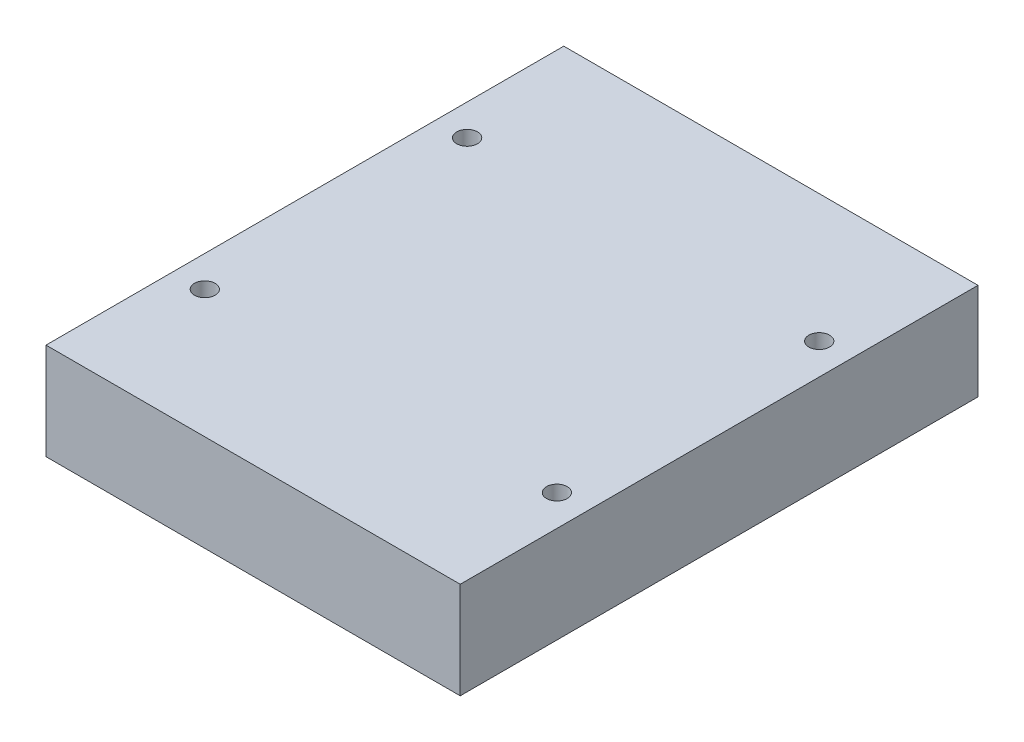
ISO-10303-21;
HEADER;
FILE_DESCRIPTION(('STEP AP214'),'2;1');
FILE_NAME('part.step','',(''),(''),'','','');
FILE_SCHEMA(('AUTOMOTIVE_DESIGN { 1 0 10303 214 1 1 1 1 }'));
ENDSEC;
DATA;
#1=APPLICATION_CONTEXT('core data for automotive mechanical design processes');
#2=APPLICATION_PROTOCOL_DEFINITION('international standard','automotive_design',2000,#1);
#3=PRODUCT_CONTEXT('',#1,'mechanical');
#4=PRODUCT('Part','Part','',(#3));
#5=PRODUCT_RELATED_PRODUCT_CATEGORY('part','',(#4));
#6=PRODUCT_DEFINITION_FORMATION('','',#4);
#7=PRODUCT_DEFINITION_CONTEXT('part definition',#1,'design');
#8=PRODUCT_DEFINITION('design','',#6,#7);
#9=PRODUCT_DEFINITION_SHAPE('','',#8);
#10=(LENGTH_UNIT() NAMED_UNIT(*) SI_UNIT(.MILLI.,.METRE.));
#11=(NAMED_UNIT(*) PLANE_ANGLE_UNIT() SI_UNIT($,.RADIAN.));
#12=(NAMED_UNIT(*) SI_UNIT($,.STERADIAN.) SOLID_ANGLE_UNIT());
#13=UNCERTAINTY_MEASURE_WITH_UNIT(LENGTH_MEASURE(1.E-05),#10,'distance_accuracy_value','');
#14=(GEOMETRIC_REPRESENTATION_CONTEXT(3) GLOBAL_UNCERTAINTY_ASSIGNED_CONTEXT((#13)) GLOBAL_UNIT_ASSIGNED_CONTEXT((#10,
#11,#12)) REPRESENTATION_CONTEXT('',''));
#15=CARTESIAN_POINT('',(0.,0.,0.));
#16=DIRECTION('',(0.,0.,1.));
#17=DIRECTION('',(1.,0.,0.));
#18=AXIS2_PLACEMENT_3D('',#15,#16,#17);
#19=CARTESIAN_POINT('',(30.,14.,-37.5));
#20=DIRECTION('',(-1.,0.,0.));
#21=DIRECTION('',(0.,0.,1.));
#22=AXIS2_PLACEMENT_3D('',#19,#20,#21);
#23=PLANE('',#22);
#24=DIRECTION('',(0.,0.,-1.));
#25=VECTOR('',#24,1.);
#26=CARTESIAN_POINT('',(30.,0.,-37.5));
#27=LINE('',#26,#25);
#28=CARTESIAN_POINT('',(30.,0.,37.5));
#29=VERTEX_POINT('',#28);
#30=CARTESIAN_POINT('',(30.,0.,-37.5));
#31=VERTEX_POINT('',#30);
#32=EDGE_CURVE('E96',#29,#31,#27,.T.);
#33=ORIENTED_EDGE('',*,*,#32,.T.);
#34=DIRECTION('',(0.,-1.,0.));
#35=VECTOR('',#34,1.);
#36=CARTESIAN_POINT('',(30.,14.,-37.5));
#37=LINE('',#36,#35);
#38=CARTESIAN_POINT('',(30.,14.,-37.5));
#39=VERTEX_POINT('',#38);
#40=EDGE_CURVE('E11',#39,#31,#37,.T.);
#41=ORIENTED_EDGE('',*,*,#40,.F.);
#42=DIRECTION('',(0.,0.,-1.));
#43=VECTOR('',#42,1.);
#44=CARTESIAN_POINT('',(30.,14.,-37.5));
#45=LINE('',#44,#43);
#46=CARTESIAN_POINT('',(30.,14.,37.5));
#47=VERTEX_POINT('',#46);
#48=EDGE_CURVE('E84',#47,#39,#45,.T.);
#49=ORIENTED_EDGE('',*,*,#48,.F.);
#50=DIRECTION('',(0.,-1.,0.));
#51=VECTOR('',#50,1.);
#52=CARTESIAN_POINT('',(30.,14.,37.5));
#53=LINE('',#52,#51);
#54=EDGE_CURVE('E92',#47,#29,#53,.T.);
#55=ORIENTED_EDGE('',*,*,#54,.T.);
#56=EDGE_LOOP('',(#33,#41,#49,#55));
#57=FACE_BOUND('',#56,.T.);
#58=ADVANCED_FACE('F33',(#57),#23,.F.);
#59=CARTESIAN_POINT('',(-30.,14.,-37.5));
#60=DIRECTION('',(0.,0.,1.));
#61=DIRECTION('',(1.,0.,0.));
#62=AXIS2_PLACEMENT_3D('',#59,#60,#61);
#63=PLANE('',#62);
#64=DIRECTION('',(-1.,0.,0.));
#65=VECTOR('',#64,1.);
#66=CARTESIAN_POINT('',(-30.,0.,-37.5));
#67=LINE('',#66,#65);
#68=CARTESIAN_POINT('',(-30.,0.,-37.5));
#69=VERTEX_POINT('',#68);
#70=EDGE_CURVE('E88',#31,#69,#67,.T.);
#71=ORIENTED_EDGE('',*,*,#70,.T.);
#72=DIRECTION('',(0.,-1.,0.));
#73=VECTOR('',#72,1.);
#74=CARTESIAN_POINT('',(-30.,14.,-37.5));
#75=LINE('',#74,#73);
#76=CARTESIAN_POINT('',(-30.,14.,-37.5));
#77=VERTEX_POINT('',#76);
#78=EDGE_CURVE('E41',#77,#69,#75,.T.);
#79=ORIENTED_EDGE('',*,*,#78,.F.);
#80=DIRECTION('',(-1.,0.,0.));
#81=VECTOR('',#80,1.);
#82=CARTESIAN_POINT('',(-30.,14.,-37.5));
#83=LINE('',#82,#81);
#84=EDGE_CURVE('E79',#39,#77,#83,.T.);
#85=ORIENTED_EDGE('',*,*,#84,.F.);
#86=ORIENTED_EDGE('',*,*,#40,.T.);
#87=EDGE_LOOP('',(#71,#79,#85,#86));
#88=FACE_BOUND('',#87,.T.);
#89=ADVANCED_FACE('F87',(#88),#63,.F.);
#90=CARTESIAN_POINT('',(-30.,14.,-37.5));
#91=DIRECTION('',(1.,0.,0.));
#92=DIRECTION('',(0.,0.,-1.));
#93=AXIS2_PLACEMENT_3D('',#90,#91,#92);
#94=PLANE('',#93);
#95=DIRECTION('',(0.,0.,1.));
#96=VECTOR('',#95,1.);
#97=CARTESIAN_POINT('',(-30.,0.,-37.5));
#98=LINE('',#97,#96);
#99=CARTESIAN_POINT('',(-30.,0.,37.5));
#100=VERTEX_POINT('',#99);
#101=EDGE_CURVE('E66',#69,#100,#98,.T.);
#102=ORIENTED_EDGE('',*,*,#101,.T.);
#103=DIRECTION('',(0.,-1.,0.));
#104=VECTOR('',#103,1.);
#105=CARTESIAN_POINT('',(-30.,14.,37.5));
#106=LINE('',#105,#104);
#107=CARTESIAN_POINT('',(-30.,14.,37.5));
#108=VERTEX_POINT('',#107);
#109=EDGE_CURVE('E89',#108,#100,#106,.T.);
#110=ORIENTED_EDGE('',*,*,#109,.F.);
#111=DIRECTION('',(0.,0.,1.));
#112=VECTOR('',#111,1.);
#113=CARTESIAN_POINT('',(-30.,14.,-37.5));
#114=LINE('',#113,#112);
#115=EDGE_CURVE('E82',#77,#108,#114,.T.);
#116=ORIENTED_EDGE('',*,*,#115,.F.);
#117=ORIENTED_EDGE('',*,*,#78,.T.);
#118=EDGE_LOOP('',(#102,#110,#116,#117));
#119=FACE_BOUND('',#118,.T.);
#120=ADVANCED_FACE('F90',(#119),#94,.F.);
#121=CARTESIAN_POINT('',(-30.,14.,37.5));
#122=DIRECTION('',(0.,0.,-1.));
#123=DIRECTION('',(-1.,0.,0.));
#124=AXIS2_PLACEMENT_3D('',#121,#122,#123);
#125=PLANE('',#124);
#126=DIRECTION('',(1.,0.,0.));
#127=VECTOR('',#126,1.);
#128=CARTESIAN_POINT('',(-30.,0.,37.5));
#129=LINE('',#128,#127);
#130=EDGE_CURVE('E72',#100,#29,#129,.T.);
#131=ORIENTED_EDGE('',*,*,#130,.T.);
#132=ORIENTED_EDGE('',*,*,#54,.F.);
#133=DIRECTION('',(1.,0.,0.));
#134=VECTOR('',#133,1.);
#135=CARTESIAN_POINT('',(-30.,14.,37.5));
#136=LINE('',#135,#134);
#137=EDGE_CURVE('E49',#108,#47,#136,.T.);
#138=ORIENTED_EDGE('',*,*,#137,.F.);
#139=ORIENTED_EDGE('',*,*,#109,.T.);
#140=EDGE_LOOP('',(#131,#132,#138,#139));
#141=FACE_BOUND('',#140,.T.);
#142=ADVANCED_FACE('F104',(#141),#125,.F.);
#143=CARTESIAN_POINT('',(0.,14.,0.));
#144=DIRECTION('',(0.,1.,0.));
#145=DIRECTION('',(0.,0.,1.));
#146=AXIS2_PLACEMENT_3D('',#143,#144,#145);
#147=PLANE('',#146);
#148=CARTESIAN_POINT('',(-25.5,14.,19.));
#149=DIRECTION('',(0.,1.,0.));
#150=DIRECTION('',(0.,0.,1.));
#151=AXIS2_PLACEMENT_3D('',#148,#149,#150);
#152=CIRCLE('',#151,1.5);
#153=CARTESIAN_POINT('',(-25.5,14.,20.5));
#154=VERTEX_POINT('',#153);
#155=EDGE_CURVE('E128',#154,#154,#152,.T.);
#156=ORIENTED_EDGE('',*,*,#155,.F.);
#157=EDGE_LOOP('',(#156));
#158=FACE_BOUND('',#157,.T.);
#159=CARTESIAN_POINT('',(25.5,14.,19.));
#160=DIRECTION('',(0.,1.,0.));
#161=DIRECTION('',(0.,0.,1.));
#162=AXIS2_PLACEMENT_3D('',#159,#160,#161);
#163=CIRCLE('',#162,1.5);
#164=CARTESIAN_POINT('',(25.5,14.,20.5));
#165=VERTEX_POINT('',#164);
#166=EDGE_CURVE('E122',#165,#165,#163,.T.);
#167=ORIENTED_EDGE('',*,*,#166,.F.);
#168=EDGE_LOOP('',(#167));
#169=FACE_BOUND('',#168,.T.);
#170=CARTESIAN_POINT('',(25.5,14.,-19.));
#171=DIRECTION('',(0.,1.,0.));
#172=DIRECTION('',(0.,0.,1.));
#173=AXIS2_PLACEMENT_3D('',#170,#171,#172);
#174=CIRCLE('',#173,1.5);
#175=CARTESIAN_POINT('',(25.5,14.,-17.5));
#176=VERTEX_POINT('',#175);
#177=EDGE_CURVE('E116',#176,#176,#174,.T.);
#178=ORIENTED_EDGE('',*,*,#177,.F.);
#179=EDGE_LOOP('',(#178));
#180=FACE_BOUND('',#179,.T.);
#181=CARTESIAN_POINT('',(-25.5,14.,-19.));
#182=DIRECTION('',(0.,1.,0.));
#183=DIRECTION('',(0.,0.,1.));
#184=AXIS2_PLACEMENT_3D('',#181,#182,#183);
#185=CIRCLE('',#184,1.5);
#186=CARTESIAN_POINT('',(-25.5,14.,-17.5));
#187=VERTEX_POINT('',#186);
#188=EDGE_CURVE('E110',#187,#187,#185,.T.);
#189=ORIENTED_EDGE('',*,*,#188,.F.);
#190=EDGE_LOOP('',(#189));
#191=FACE_BOUND('',#190,.T.);
#192=ORIENTED_EDGE('',*,*,#48,.T.);
#193=ORIENTED_EDGE('',*,*,#84,.T.);
#194=ORIENTED_EDGE('',*,*,#115,.T.);
#195=ORIENTED_EDGE('',*,*,#137,.T.);
#196=EDGE_LOOP('',(#192,#193,#194,#195));
#197=FACE_BOUND('',#196,.T.);
#198=ADVANCED_FACE('F80',(#158,#169,#180,#191,#197),#147,.T.);
#199=CARTESIAN_POINT('',(0.,0.,0.));
#200=DIRECTION('',(0.,1.,0.));
#201=DIRECTION('',(0.,0.,1.));
#202=AXIS2_PLACEMENT_3D('',#199,#200,#201);
#203=PLANE('',#202);
#204=CARTESIAN_POINT('',(-25.5,0.,19.));
#205=DIRECTION('',(0.,1.,0.));
#206=DIRECTION('',(0.,0.,1.));
#207=AXIS2_PLACEMENT_3D('',#204,#205,#206);
#208=CIRCLE('',#207,1.5);
#209=CARTESIAN_POINT('',(-25.5,0.,20.5));
#210=VERTEX_POINT('',#209);
#211=EDGE_CURVE('E125',#210,#210,#208,.T.);
#212=ORIENTED_EDGE('',*,*,#211,.T.);
#213=EDGE_LOOP('',(#212));
#214=FACE_BOUND('',#213,.T.);
#215=CARTESIAN_POINT('',(25.5,0.,19.));
#216=DIRECTION('',(0.,1.,0.));
#217=DIRECTION('',(0.,0.,1.));
#218=AXIS2_PLACEMENT_3D('',#215,#216,#217);
#219=CIRCLE('',#218,1.5);
#220=CARTESIAN_POINT('',(25.5,0.,20.5));
#221=VERTEX_POINT('',#220);
#222=EDGE_CURVE('E119',#221,#221,#219,.T.);
#223=ORIENTED_EDGE('',*,*,#222,.T.);
#224=EDGE_LOOP('',(#223));
#225=FACE_BOUND('',#224,.T.);
#226=CARTESIAN_POINT('',(25.5,0.,-19.));
#227=DIRECTION('',(0.,1.,0.));
#228=DIRECTION('',(0.,0.,1.));
#229=AXIS2_PLACEMENT_3D('',#226,#227,#228);
#230=CIRCLE('',#229,1.5);
#231=CARTESIAN_POINT('',(25.5,0.,-17.5));
#232=VERTEX_POINT('',#231);
#233=EDGE_CURVE('E113',#232,#232,#230,.T.);
#234=ORIENTED_EDGE('',*,*,#233,.T.);
#235=EDGE_LOOP('',(#234));
#236=FACE_BOUND('',#235,.T.);
#237=CARTESIAN_POINT('',(-25.5,0.,-19.));
#238=DIRECTION('',(0.,1.,0.));
#239=DIRECTION('',(0.,0.,1.));
#240=AXIS2_PLACEMENT_3D('',#237,#238,#239);
#241=CIRCLE('',#240,1.5);
#242=CARTESIAN_POINT('',(-25.5,0.,-17.5));
#243=VERTEX_POINT('',#242);
#244=EDGE_CURVE('E99',#243,#243,#241,.T.);
#245=ORIENTED_EDGE('',*,*,#244,.T.);
#246=EDGE_LOOP('',(#245));
#247=FACE_BOUND('',#246,.T.);
#248=ORIENTED_EDGE('',*,*,#32,.F.);
#249=ORIENTED_EDGE('',*,*,#130,.F.);
#250=ORIENTED_EDGE('',*,*,#101,.F.);
#251=ORIENTED_EDGE('',*,*,#70,.F.);
#252=EDGE_LOOP('',(#248,#249,#250,#251));
#253=FACE_BOUND('',#252,.T.);
#254=ADVANCED_FACE('F107',(#214,#225,#236,#247,#253),#203,.F.);
#255=CARTESIAN_POINT('',(-25.5,0.,-19.));
#256=DIRECTION('',(0.,1.,0.));
#257=DIRECTION('',(0.,0.,1.));
#258=AXIS2_PLACEMENT_3D('',#255,#256,#257);
#259=CYLINDRICAL_SURFACE('',#258,1.5);
#260=ORIENTED_EDGE('',*,*,#244,.F.);
#261=EDGE_LOOP('',(#260));
#262=FACE_BOUND('',#261,.T.);
#263=ORIENTED_EDGE('',*,*,#188,.T.);
#264=EDGE_LOOP('',(#263));
#265=FACE_BOUND('',#264,.T.);
#266=ADVANCED_FACE('F152',(#262,#265),#259,.F.);
#267=CARTESIAN_POINT('',(25.5,0.,-19.));
#268=DIRECTION('',(0.,1.,0.));
#269=DIRECTION('',(0.,0.,1.));
#270=AXIS2_PLACEMENT_3D('',#267,#268,#269);
#271=CYLINDRICAL_SURFACE('',#270,1.5);
#272=ORIENTED_EDGE('',*,*,#233,.F.);
#273=EDGE_LOOP('',(#272));
#274=FACE_BOUND('',#273,.T.);
#275=ORIENTED_EDGE('',*,*,#177,.T.);
#276=EDGE_LOOP('',(#275));
#277=FACE_BOUND('',#276,.T.);
#278=ADVANCED_FACE('F154',(#274,#277),#271,.F.);
#279=CARTESIAN_POINT('',(25.5,0.,19.));
#280=DIRECTION('',(0.,1.,0.));
#281=DIRECTION('',(0.,0.,1.));
#282=AXIS2_PLACEMENT_3D('',#279,#280,#281);
#283=CYLINDRICAL_SURFACE('',#282,1.5);
#284=ORIENTED_EDGE('',*,*,#222,.F.);
#285=EDGE_LOOP('',(#284));
#286=FACE_BOUND('',#285,.T.);
#287=ORIENTED_EDGE('',*,*,#166,.T.);
#288=EDGE_LOOP('',(#287));
#289=FACE_BOUND('',#288,.T.);
#290=ADVANCED_FACE('F139',(#286,#289),#283,.F.);
#291=CARTESIAN_POINT('',(-25.5,0.,19.));
#292=DIRECTION('',(0.,1.,0.));
#293=DIRECTION('',(0.,0.,1.));
#294=AXIS2_PLACEMENT_3D('',#291,#292,#293);
#295=CYLINDRICAL_SURFACE('',#294,1.5);
#296=ORIENTED_EDGE('',*,*,#211,.F.);
#297=EDGE_LOOP('',(#296));
#298=FACE_BOUND('',#297,.T.);
#299=ORIENTED_EDGE('',*,*,#155,.T.);
#300=EDGE_LOOP('',(#299));
#301=FACE_BOUND('',#300,.T.);
#302=ADVANCED_FACE('F136',(#298,#301),#295,.F.);
#303=CLOSED_SHELL('',(#58,#89,#120,#142,#198,#254,#266,#278,#290,#302));
#304=MANIFOLD_SOLID_BREP('B2',#303);
#305=ADVANCED_BREP_SHAPE_REPRESENTATION('',(#18,#304),#14);
#306=SHAPE_DEFINITION_REPRESENTATION(#9,#305);
ENDSEC;
END-ISO-10303-21;
